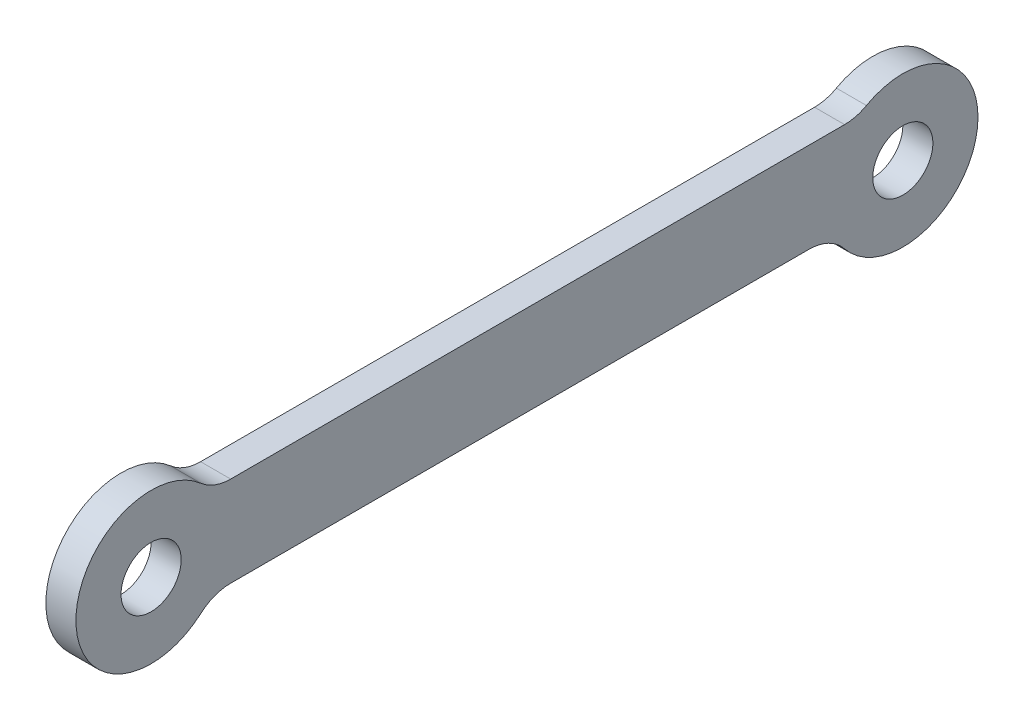
ISO-10303-21;
HEADER;
FILE_DESCRIPTION(('STEP AP214'),'2;1');
FILE_NAME('part.step','',(''),(''),'','','');
FILE_SCHEMA(('AUTOMOTIVE_DESIGN { 1 0 10303 214 1 1 1 1 }'));
ENDSEC;
DATA;
#1=APPLICATION_CONTEXT('core data for automotive mechanical design processes');
#2=APPLICATION_PROTOCOL_DEFINITION('international standard','automotive_design',2000,#1);
#3=PRODUCT_CONTEXT('',#1,'mechanical');
#4=PRODUCT('Part','Part','',(#3));
#5=PRODUCT_RELATED_PRODUCT_CATEGORY('part','',(#4));
#6=PRODUCT_DEFINITION_FORMATION('','',#4);
#7=PRODUCT_DEFINITION_CONTEXT('part definition',#1,'design');
#8=PRODUCT_DEFINITION('design','',#6,#7);
#9=PRODUCT_DEFINITION_SHAPE('','',#8);
#10=(LENGTH_UNIT() NAMED_UNIT(*) SI_UNIT(.MILLI.,.METRE.));
#11=(NAMED_UNIT(*) PLANE_ANGLE_UNIT() SI_UNIT($,.RADIAN.));
#12=(NAMED_UNIT(*) SI_UNIT($,.STERADIAN.) SOLID_ANGLE_UNIT());
#13=UNCERTAINTY_MEASURE_WITH_UNIT(LENGTH_MEASURE(1.E-05),#10,'distance_accuracy_value','');
#14=(GEOMETRIC_REPRESENTATION_CONTEXT(3) GLOBAL_UNCERTAINTY_ASSIGNED_CONTEXT((#13)) GLOBAL_UNIT_ASSIGNED_CONTEXT((#10,
#11,#12)) REPRESENTATION_CONTEXT('',''));
#15=CARTESIAN_POINT('',(0.,0.,0.));
#16=DIRECTION('',(0.,0.,1.));
#17=DIRECTION('',(1.,0.,0.));
#18=AXIS2_PLACEMENT_3D('',#15,#16,#17);
#19=CARTESIAN_POINT('',(0.,0.,0.));
#20=DIRECTION('',(1.,0.,0.));
#21=DIRECTION('',(0.,0.,-1.));
#22=AXIS2_PLACEMENT_3D('',#19,#20,#21);
#23=PLANE('',#22);
#24=CARTESIAN_POINT('',(0.,0.,0.));
#25=DIRECTION('',(1.,0.,0.));
#26=DIRECTION('',(0.,0.,-1.));
#27=AXIS2_PLACEMENT_3D('',#24,#25,#26);
#28=CIRCLE('',#27,2.);
#29=CARTESIAN_POINT('',(0.,0.,-2.));
#30=VERTEX_POINT('',#29);
#31=EDGE_CURVE('E250',#30,#30,#28,.T.);
#32=ORIENTED_EDGE('',*,*,#31,.T.);
#33=EDGE_LOOP('',(#32));
#34=FACE_BOUND('',#33,.T.);
#35=CARTESIAN_POINT('',(0.,-1.00000000000001,-50.));
#36=DIRECTION('',(1.,0.,0.));
#37=DIRECTION('',(0.,0.,-1.));
#38=AXIS2_PLACEMENT_3D('',#35,#36,#37);
#39=CIRCLE('',#38,2.);
#40=CARTESIAN_POINT('',(0.,-1.00000000000001,-52.));
#41=VERTEX_POINT('',#40);
#42=EDGE_CURVE('E252',#41,#41,#39,.T.);
#43=ORIENTED_EDGE('',*,*,#42,.T.);
#44=EDGE_LOOP('',(#43));
#45=FACE_BOUND('',#44,.T.);
#46=CARTESIAN_POINT('',(0.,0.,0.));
#47=DIRECTION('',(1.,0.,0.));
#48=DIRECTION('',(0.,0.,-1.));
#49=AXIS2_PLACEMENT_3D('',#46,#47,#48);
#50=CIRCLE('',#49,4.99999999999999);
#51=CARTESIAN_POINT('',(0.,3.74999999999999,-3.30718913883074));
#52=VERTEX_POINT('',#51);
#53=CARTESIAN_POINT('',(0.,-3.75,-3.30718913883072));
#54=VERTEX_POINT('',#53);
#55=EDGE_CURVE('E154',#52,#54,#50,.T.);
#56=ORIENTED_EDGE('',*,*,#55,.F.);
#57=CARTESIAN_POINT('',(0.,5.99999999999999,-5.29150262212918));
#58=DIRECTION('',(1.,0.,0.));
#59=DIRECTION('',(0.,0.,-1.));
#60=AXIS2_PLACEMENT_3D('',#57,#58,#59);
#61=CIRCLE('',#60,3.);
#62=CARTESIAN_POINT('',(0.,2.99999999999999,-5.29150262212918));
#63=VERTEX_POINT('',#62);
#64=EDGE_CURVE('E75',#52,#63,#61,.T.);
#65=ORIENTED_EDGE('',*,*,#64,.T.);
#66=DIRECTION('',(0.,0.,-1.));
#67=VECTOR('',#66,1.);
#68=CARTESIAN_POINT('',(0.,2.99999999999999,0.));
#69=LINE('',#68,#67);
#70=CARTESIAN_POINT('',(0.,2.99999999999999,-46.1270166537926));
#71=VERTEX_POINT('',#70);
#72=EDGE_CURVE('E261',#63,#71,#69,.T.);
#73=ORIENTED_EDGE('',*,*,#72,.T.);
#74=CARTESIAN_POINT('',(0.,5.99999999999999,-46.1270166537926));
#75=DIRECTION('',(1.,0.,0.));
#76=DIRECTION('',(0.,0.,-1.));
#77=AXIS2_PLACEMENT_3D('',#74,#75,#76);
#78=CIRCLE('',#77,3.);
#79=CARTESIAN_POINT('',(0.,3.375,-47.5793854086204));
#80=VERTEX_POINT('',#79);
#81=EDGE_CURVE('E82',#71,#80,#78,.T.);
#82=ORIENTED_EDGE('',*,*,#81,.T.);
#83=CARTESIAN_POINT('',(0.,-1.00000000000001,-50.));
#84=DIRECTION('',(1.,0.,0.));
#85=DIRECTION('',(0.,0.,-1.));
#86=AXIS2_PLACEMENT_3D('',#83,#84,#85);
#87=CIRCLE('',#86,5.);
#88=CARTESIAN_POINT('',(0.,-4.125,-46.096876251001));
#89=VERTEX_POINT('',#88);
#90=EDGE_CURVE('E251',#89,#80,#87,.T.);
#91=ORIENTED_EDGE('',*,*,#90,.F.);
#92=CARTESIAN_POINT('',(0.,-6.00000000000001,-43.7550020016016));
#93=DIRECTION('',(1.,0.,0.));
#94=DIRECTION('',(0.,0.,-1.));
#95=AXIS2_PLACEMENT_3D('',#92,#93,#94);
#96=CIRCLE('',#95,3.);
#97=CARTESIAN_POINT('',(0.,-3.00000000000001,-43.7550020016016));
#98=VERTEX_POINT('',#97);
#99=EDGE_CURVE('E143',#89,#98,#96,.T.);
#100=ORIENTED_EDGE('',*,*,#99,.T.);
#101=DIRECTION('',(0.,0.,-1.));
#102=VECTOR('',#101,1.);
#103=CARTESIAN_POINT('',(0.,-3.00000000000001,0.));
#104=LINE('',#103,#102);
#105=CARTESIAN_POINT('',(0.,-3.00000000000001,-5.29150262212916));
#106=VERTEX_POINT('',#105);
#107=EDGE_CURVE('E192',#106,#98,#104,.T.);
#108=ORIENTED_EDGE('',*,*,#107,.F.);
#109=CARTESIAN_POINT('',(0.,-6.00000000000001,-5.29150262212916));
#110=DIRECTION('',(1.,0.,0.));
#111=DIRECTION('',(0.,0.,-1.));
#112=AXIS2_PLACEMENT_3D('',#109,#110,#111);
#113=CIRCLE('',#112,3.);
#114=EDGE_CURVE('E144',#106,#54,#113,.T.);
#115=ORIENTED_EDGE('',*,*,#114,.T.);
#116=EDGE_LOOP('',(#56,#65,#73,#82,#91,#100,#108,#115));
#117=FACE_BOUND('',#116,.T.);
#118=ADVANCED_FACE('F67',(#34,#45,#117),#23,.F.);
#119=CARTESIAN_POINT('',(2.,0.,0.));
#120=DIRECTION('',(1.,0.,0.));
#121=DIRECTION('',(0.,0.,-1.));
#122=AXIS2_PLACEMENT_3D('',#119,#120,#121);
#123=PLANE('',#122);
#124=CARTESIAN_POINT('',(2.,0.,0.));
#125=DIRECTION('',(1.,0.,0.));
#126=DIRECTION('',(0.,0.,-1.));
#127=AXIS2_PLACEMENT_3D('',#124,#125,#126);
#128=CIRCLE('',#127,2.);
#129=CARTESIAN_POINT('',(2.,0.,-2.));
#130=VERTEX_POINT('',#129);
#131=EDGE_CURVE('E248',#130,#130,#128,.T.);
#132=ORIENTED_EDGE('',*,*,#131,.F.);
#133=EDGE_LOOP('',(#132));
#134=FACE_BOUND('',#133,.T.);
#135=CARTESIAN_POINT('',(2.,-1.00000000000001,-50.));
#136=DIRECTION('',(1.,0.,0.));
#137=DIRECTION('',(0.,0.,-1.));
#138=AXIS2_PLACEMENT_3D('',#135,#136,#137);
#139=CIRCLE('',#138,2.);
#140=CARTESIAN_POINT('',(2.,-1.00000000000001,-52.));
#141=VERTEX_POINT('',#140);
#142=EDGE_CURVE('E267',#141,#141,#139,.T.);
#143=ORIENTED_EDGE('',*,*,#142,.F.);
#144=EDGE_LOOP('',(#143));
#145=FACE_BOUND('',#144,.T.);
#146=DIRECTION('',(0.,0.,-1.));
#147=VECTOR('',#146,1.);
#148=CARTESIAN_POINT('',(2.,-3.00000000000001,0.));
#149=LINE('',#148,#147);
#150=CARTESIAN_POINT('',(2.,-3.00000000000001,-5.29150262212916));
#151=VERTEX_POINT('',#150);
#152=CARTESIAN_POINT('',(2.,-3.00000000000001,-43.7550020016016));
#153=VERTEX_POINT('',#152);
#154=EDGE_CURVE('E136',#151,#153,#149,.T.);
#155=ORIENTED_EDGE('',*,*,#154,.T.);
#156=CARTESIAN_POINT('',(2.,-6.00000000000001,-43.7550020016016));
#157=DIRECTION('',(1.,0.,0.));
#158=DIRECTION('',(0.,0.,-1.));
#159=AXIS2_PLACEMENT_3D('',#156,#157,#158);
#160=CIRCLE('',#159,3.);
#161=CARTESIAN_POINT('',(2.,-4.125,-46.096876251001));
#162=VERTEX_POINT('',#161);
#163=EDGE_CURVE('E178',#153,#162,#160,.F.);
#164=ORIENTED_EDGE('',*,*,#163,.T.);
#165=CARTESIAN_POINT('',(2.,-1.00000000000001,-50.));
#166=DIRECTION('',(1.,0.,0.));
#167=DIRECTION('',(0.,0.,-1.));
#168=AXIS2_PLACEMENT_3D('',#165,#166,#167);
#169=CIRCLE('',#168,5.);
#170=CARTESIAN_POINT('',(2.,3.375,-47.5793854086204));
#171=VERTEX_POINT('',#170);
#172=EDGE_CURVE('E188',#162,#171,#169,.T.);
#173=ORIENTED_EDGE('',*,*,#172,.T.);
#174=CARTESIAN_POINT('',(2.,5.99999999999999,-46.1270166537926));
#175=DIRECTION('',(1.,0.,0.));
#176=DIRECTION('',(0.,0.,-1.));
#177=AXIS2_PLACEMENT_3D('',#174,#175,#176);
#178=CIRCLE('',#177,3.);
#179=CARTESIAN_POINT('',(2.,2.99999999999999,-46.1270166537926));
#180=VERTEX_POINT('',#179);
#181=EDGE_CURVE('E181',#171,#180,#178,.F.);
#182=ORIENTED_EDGE('',*,*,#181,.T.);
#183=DIRECTION('',(0.,0.,-1.));
#184=VECTOR('',#183,1.);
#185=CARTESIAN_POINT('',(2.,2.99999999999999,0.));
#186=LINE('',#185,#184);
#187=CARTESIAN_POINT('',(2.,2.99999999999999,-5.29150262212918));
#188=VERTEX_POINT('',#187);
#189=EDGE_CURVE('E155',#188,#180,#186,.T.);
#190=ORIENTED_EDGE('',*,*,#189,.F.);
#191=CARTESIAN_POINT('',(2.,5.99999999999999,-5.29150262212918));
#192=DIRECTION('',(1.,0.,0.));
#193=DIRECTION('',(0.,0.,-1.));
#194=AXIS2_PLACEMENT_3D('',#191,#192,#193);
#195=CIRCLE('',#194,3.);
#196=CARTESIAN_POINT('',(2.,3.74999999999999,-3.30718913883074));
#197=VERTEX_POINT('',#196);
#198=EDGE_CURVE('E12',#188,#197,#195,.F.);
#199=ORIENTED_EDGE('',*,*,#198,.T.);
#200=CARTESIAN_POINT('',(2.,0.,0.));
#201=DIRECTION('',(1.,0.,0.));
#202=DIRECTION('',(0.,0.,-1.));
#203=AXIS2_PLACEMENT_3D('',#200,#201,#202);
#204=CIRCLE('',#203,4.99999999999999);
#205=CARTESIAN_POINT('',(2.,-3.75,-3.30718913883072));
#206=VERTEX_POINT('',#205);
#207=EDGE_CURVE('E139',#197,#206,#204,.T.);
#208=ORIENTED_EDGE('',*,*,#207,.T.);
#209=CARTESIAN_POINT('',(2.,-6.00000000000001,-5.29150262212916));
#210=DIRECTION('',(1.,0.,0.));
#211=DIRECTION('',(0.,0.,-1.));
#212=AXIS2_PLACEMENT_3D('',#209,#210,#211);
#213=CIRCLE('',#212,3.);
#214=EDGE_CURVE('E133',#206,#151,#213,.F.);
#215=ORIENTED_EDGE('',*,*,#214,.T.);
#216=EDGE_LOOP('',(#155,#164,#173,#182,#190,#199,#208,#215));
#217=FACE_BOUND('',#216,.T.);
#218=ADVANCED_FACE('F135',(#134,#145,#217),#123,.T.);
#219=CARTESIAN_POINT('',(2.,0.,0.));
#220=DIRECTION('',(-1.,0.,0.));
#221=DIRECTION('',(0.,0.,1.));
#222=AXIS2_PLACEMENT_3D('',#219,#220,#221);
#223=CYLINDRICAL_SURFACE('',#222,4.99999999999999);
#224=ORIENTED_EDGE('',*,*,#55,.T.);
#225=DIRECTION('',(-1.,0.,0.));
#226=VECTOR('',#225,1.);
#227=CARTESIAN_POINT('',(2.,-3.75,-3.30718913883072));
#228=LINE('',#227,#226);
#229=EDGE_CURVE('E161',#54,#206,#228,.F.);
#230=ORIENTED_EDGE('',*,*,#229,.T.);
#231=ORIENTED_EDGE('',*,*,#207,.F.);
#232=DIRECTION('',(-1.,0.,0.));
#233=VECTOR('',#232,1.);
#234=CARTESIAN_POINT('',(2.,3.74999999999999,-3.30718913883074));
#235=LINE('',#234,#233);
#236=EDGE_CURVE('E158',#197,#52,#235,.T.);
#237=ORIENTED_EDGE('',*,*,#236,.T.);
#238=EDGE_LOOP('',(#224,#230,#231,#237));
#239=FACE_BOUND('',#238,.T.);
#240=ADVANCED_FACE('F207',(#239),#223,.T.);
#241=CARTESIAN_POINT('',(2.,-1.00000000000001,-50.));
#242=DIRECTION('',(-1.,0.,0.));
#243=DIRECTION('',(0.,0.,1.));
#244=AXIS2_PLACEMENT_3D('',#241,#242,#243);
#245=CYLINDRICAL_SURFACE('',#244,5.);
#246=ORIENTED_EDGE('',*,*,#172,.F.);
#247=DIRECTION('',(-1.,0.,0.));
#248=VECTOR('',#247,1.);
#249=CARTESIAN_POINT('',(2.,-4.12500000000001,-46.096876251001));
#250=LINE('',#249,#248);
#251=EDGE_CURVE('E169',#162,#89,#250,.T.);
#252=ORIENTED_EDGE('',*,*,#251,.T.);
#253=ORIENTED_EDGE('',*,*,#90,.T.);
#254=DIRECTION('',(-1.,0.,0.));
#255=VECTOR('',#254,1.);
#256=CARTESIAN_POINT('',(2.,3.375,-47.5793854086204));
#257=LINE('',#256,#255);
#258=EDGE_CURVE('E167',#80,#171,#257,.F.);
#259=ORIENTED_EDGE('',*,*,#258,.T.);
#260=EDGE_LOOP('',(#246,#252,#253,#259));
#261=FACE_BOUND('',#260,.T.);
#262=ADVANCED_FACE('F214',(#261),#245,.T.);
#263=CARTESIAN_POINT('',(2.,2.99999999999999,0.));
#264=DIRECTION('',(0.,1.,0.));
#265=DIRECTION('',(0.,0.,1.));
#266=AXIS2_PLACEMENT_3D('',#263,#264,#265);
#267=PLANE('',#266);
#268=ORIENTED_EDGE('',*,*,#189,.T.);
#269=DIRECTION('',(-1.,0.,0.));
#270=VECTOR('',#269,1.);
#271=CARTESIAN_POINT('',(2.,2.99999999999999,-46.1270166537926));
#272=LINE('',#271,#270);
#273=EDGE_CURVE('E174',#180,#71,#272,.T.);
#274=ORIENTED_EDGE('',*,*,#273,.T.);
#275=ORIENTED_EDGE('',*,*,#72,.F.);
#276=DIRECTION('',(-1.,0.,0.));
#277=VECTOR('',#276,1.);
#278=CARTESIAN_POINT('',(2.,2.99999999999999,-5.29150262212918));
#279=LINE('',#278,#277);
#280=EDGE_CURVE('E172',#63,#188,#279,.F.);
#281=ORIENTED_EDGE('',*,*,#280,.T.);
#282=EDGE_LOOP('',(#268,#274,#275,#281));
#283=FACE_BOUND('',#282,.T.);
#284=ADVANCED_FACE('F190',(#283),#267,.T.);
#285=CARTESIAN_POINT('',(2.,-3.00000000000001,0.));
#286=DIRECTION('',(0.,1.,0.));
#287=DIRECTION('',(0.,0.,1.));
#288=AXIS2_PLACEMENT_3D('',#285,#286,#287);
#289=PLANE('',#288);
#290=ORIENTED_EDGE('',*,*,#154,.F.);
#291=DIRECTION('',(1.,0.,0.));
#292=VECTOR('',#291,1.);
#293=CARTESIAN_POINT('',(0.,-3.00000000000001,-5.29150262212916));
#294=LINE('',#293,#292);
#295=EDGE_CURVE('E150',#151,#106,#294,.F.);
#296=ORIENTED_EDGE('',*,*,#295,.T.);
#297=ORIENTED_EDGE('',*,*,#107,.T.);
#298=DIRECTION('',(1.,0.,0.));
#299=VECTOR('',#298,1.);
#300=CARTESIAN_POINT('',(2.,-3.00000000000001,-43.7550020016016));
#301=LINE('',#300,#299);
#302=EDGE_CURVE('E153',#98,#153,#301,.T.);
#303=ORIENTED_EDGE('',*,*,#302,.T.);
#304=EDGE_LOOP('',(#290,#296,#297,#303));
#305=FACE_BOUND('',#304,.T.);
#306=ADVANCED_FACE('F148',(#305),#289,.F.);
#307=CARTESIAN_POINT('',(-1.2E-05,-1.00000000000001,-50.));
#308=DIRECTION('',(1.,0.,0.));
#309=DIRECTION('',(0.,0.,-1.));
#310=AXIS2_PLACEMENT_3D('',#307,#308,#309);
#311=CYLINDRICAL_SURFACE('',#310,2.);
#312=CARTESIAN_POINT('',(2.,-1.00000000000001,-52.));
#313=CARTESIAN_POINT('',(1.97916666666667,-1.00000000000001,-52.));
#314=CARTESIAN_POINT('',(1.95833333333333,-1.00000000000001,-52.));
#315=CARTESIAN_POINT('',(1.91666666666667,-1.00000000000001,-52.));
#316=CARTESIAN_POINT('',(1.89583333333333,-1.00000000000001,-52.));
#317=CARTESIAN_POINT('',(1.85416666666667,-1.00000000000001,-52.));
#318=CARTESIAN_POINT('',(1.83333333333333,-1.00000000000001,-52.));
#319=CARTESIAN_POINT('',(1.79166666666667,-1.00000000000001,-52.));
#320=CARTESIAN_POINT('',(1.77083333333333,-1.00000000000001,-52.));
#321=CARTESIAN_POINT('',(1.72916666666667,-1.00000000000001,-52.));
#322=CARTESIAN_POINT('',(1.70833333333333,-1.00000000000001,-52.));
#323=CARTESIAN_POINT('',(1.66666666666667,-1.00000000000001,-52.));
#324=CARTESIAN_POINT('',(1.64583333333333,-1.00000000000001,-52.));
#325=CARTESIAN_POINT('',(1.60416666666667,-1.00000000000001,-52.));
#326=CARTESIAN_POINT('',(1.58333333333333,-1.00000000000001,-52.));
#327=CARTESIAN_POINT('',(1.54166666666667,-1.00000000000001,-52.));
#328=CARTESIAN_POINT('',(1.52083333333333,-1.00000000000001,-52.));
#329=CARTESIAN_POINT('',(1.47916666666667,-1.00000000000001,-52.));
#330=CARTESIAN_POINT('',(1.45833333333333,-1.00000000000001,-52.));
#331=CARTESIAN_POINT('',(1.41666666666667,-1.00000000000001,-52.));
#332=CARTESIAN_POINT('',(1.39583333333333,-1.00000000000001,-52.));
#333=CARTESIAN_POINT('',(1.35416666666667,-1.00000000000001,-52.));
#334=CARTESIAN_POINT('',(1.33333333333333,-1.00000000000001,-52.));
#335=CARTESIAN_POINT('',(1.29166666666667,-1.00000000000001,-52.));
#336=CARTESIAN_POINT('',(1.27083333333333,-1.00000000000001,-52.));
#337=CARTESIAN_POINT('',(1.22916666666667,-1.00000000000001,-52.));
#338=CARTESIAN_POINT('',(1.20833333333333,-1.00000000000001,-52.));
#339=CARTESIAN_POINT('',(1.16666666666667,-1.00000000000001,-52.));
#340=CARTESIAN_POINT('',(1.14583333333333,-1.00000000000001,-52.));
#341=CARTESIAN_POINT('',(1.10416666666667,-1.00000000000001,-52.));
#342=CARTESIAN_POINT('',(1.08333333333333,-1.00000000000001,-52.));
#343=CARTESIAN_POINT('',(1.04166666666667,-1.00000000000001,-52.));
#344=CARTESIAN_POINT('',(1.02083333333333,-1.00000000000001,-52.));
#345=CARTESIAN_POINT('',(0.979166666666667,-1.00000000000001,-52.));
#346=CARTESIAN_POINT('',(0.958333333333334,-1.00000000000001,-52.));
#347=CARTESIAN_POINT('',(0.916666666666667,-1.00000000000001,-52.));
#348=CARTESIAN_POINT('',(0.895833333333334,-1.00000000000001,-52.));
#349=CARTESIAN_POINT('',(0.854166666666667,-1.00000000000001,-52.));
#350=CARTESIAN_POINT('',(0.833333333333334,-1.00000000000001,-52.));
#351=CARTESIAN_POINT('',(0.791666666666667,-1.00000000000001,-52.));
#352=CARTESIAN_POINT('',(0.770833333333334,-1.00000000000001,-52.));
#353=CARTESIAN_POINT('',(0.729166666666667,-1.00000000000001,-52.));
#354=CARTESIAN_POINT('',(0.708333333333334,-1.00000000000001,-52.));
#355=CARTESIAN_POINT('',(0.666666666666667,-1.00000000000001,-52.));
#356=CARTESIAN_POINT('',(0.645833333333334,-1.00000000000001,-52.));
#357=CARTESIAN_POINT('',(0.604166666666667,-1.00000000000001,-52.));
#358=CARTESIAN_POINT('',(0.583333333333333,-1.00000000000001,-52.));
#359=CARTESIAN_POINT('',(0.541666666666667,-1.00000000000001,-52.));
#360=CARTESIAN_POINT('',(0.520833333333333,-1.00000000000001,-52.));
#361=CARTESIAN_POINT('',(0.479166666666667,-1.00000000000001,-52.));
#362=CARTESIAN_POINT('',(0.458333333333334,-1.00000000000001,-52.));
#363=CARTESIAN_POINT('',(0.416666666666667,-1.00000000000001,-52.));
#364=CARTESIAN_POINT('',(0.395833333333334,-1.00000000000001,-52.));
#365=CARTESIAN_POINT('',(0.354166666666667,-1.00000000000001,-52.));
#366=CARTESIAN_POINT('',(0.333333333333334,-1.00000000000001,-52.));
#367=CARTESIAN_POINT('',(0.291666666666667,-1.00000000000001,-52.));
#368=CARTESIAN_POINT('',(0.270833333333333,-1.00000000000001,-52.));
#369=CARTESIAN_POINT('',(0.229166666666667,-1.00000000000001,-52.));
#370=CARTESIAN_POINT('',(0.208333333333333,-1.00000000000001,-52.));
#371=CARTESIAN_POINT('',(0.166666666666667,-1.00000000000001,-52.));
#372=CARTESIAN_POINT('',(0.145833333333334,-1.00000000000001,-52.));
#373=CARTESIAN_POINT('',(0.104166666666667,-1.00000000000001,-52.));
#374=CARTESIAN_POINT('',(0.0833333333333336,-1.00000000000001,-52.));
#375=CARTESIAN_POINT('',(0.0416666666666669,-1.00000000000001,-52.));
#376=CARTESIAN_POINT('',(0.0208333333333335,-1.00000000000001,-52.));
#377=CARTESIAN_POINT('',(0.,-1.00000000000001,-52.));
#378=B_SPLINE_CURVE_WITH_KNOTS('',3,(#312,#313,#314,#315,#316,#317,#318,#319,#320,#321,#322,
#323,#324,#325,#326,#327,#328,#329,#330,#331,#332,#333,#334,#335,#336,#337,#338,#339,#340,#341,
#342,#343,#344,#345,#346,#347,#348,#349,#350,#351,#352,#353,#354,#355,#356,#357,#358,#359,#360,
#361,#362,#363,#364,#365,#366,#367,#368,#369,#370,#371,#372,#373,#374,#375,#376,#377),
.UNSPECIFIED.,.F.,.F.,(4,2,2,2,2,2,2,2,2,2,2,2,2,2,2,2,2,2,2,2,2,2,2,2,2,2,2,2,2,2,2,2,4),(0.,
0.0624999999999996,0.125,0.1875,0.25,0.3125,0.375,0.4375,0.5,0.5625,0.625,0.6875,0.75,0.8125,
0.875,0.9375,1.,1.0625,1.125,1.1875,1.25,1.3125,1.375,1.4375,1.5,1.5625,1.625,1.6875,1.75,
1.8125,1.875,1.9375,2.),.UNSPECIFIED.);
#379=EDGE_CURVE('BSEAM213',#141,#41,#378,.T.);
#380=ORIENTED_EDGE('',*,*,#142,.T.);
#381=ORIENTED_EDGE('',*,*,#42,.F.);
#382=ORIENTED_EDGE('',*,*,#379,.T.);
#383=ORIENTED_EDGE('',*,*,#379,.F.);
#384=EDGE_LOOP('',(#380,#382,#381,#383));
#385=FACE_BOUND('',#384,.T.);
#386=ADVANCED_FACE('F213',(#385),#311,.F.);
#387=CARTESIAN_POINT('',(-1.2E-05,0.,0.));
#388=DIRECTION('',(1.,0.,0.));
#389=DIRECTION('',(0.,0.,-1.));
#390=AXIS2_PLACEMENT_3D('',#387,#388,#389);
#391=CYLINDRICAL_SURFACE('',#390,2.);
#392=CARTESIAN_POINT('',(2.,0.,-2.));
#393=CARTESIAN_POINT('',(1.97916666666667,0.,-2.));
#394=CARTESIAN_POINT('',(1.95833333333333,0.,-2.));
#395=CARTESIAN_POINT('',(1.91666666666667,0.,-2.));
#396=CARTESIAN_POINT('',(1.89583333333333,0.,-2.));
#397=CARTESIAN_POINT('',(1.85416666666667,0.,-2.));
#398=CARTESIAN_POINT('',(1.83333333333333,0.,-2.));
#399=CARTESIAN_POINT('',(1.79166666666667,0.,-2.));
#400=CARTESIAN_POINT('',(1.77083333333333,0.,-2.));
#401=CARTESIAN_POINT('',(1.72916666666667,0.,-2.));
#402=CARTESIAN_POINT('',(1.70833333333333,0.,-2.));
#403=CARTESIAN_POINT('',(1.66666666666667,0.,-2.));
#404=CARTESIAN_POINT('',(1.64583333333333,0.,-2.));
#405=CARTESIAN_POINT('',(1.60416666666667,0.,-2.));
#406=CARTESIAN_POINT('',(1.58333333333333,0.,-2.));
#407=CARTESIAN_POINT('',(1.54166666666667,0.,-2.));
#408=CARTESIAN_POINT('',(1.52083333333333,0.,-2.));
#409=CARTESIAN_POINT('',(1.47916666666667,0.,-2.));
#410=CARTESIAN_POINT('',(1.45833333333333,0.,-2.));
#411=CARTESIAN_POINT('',(1.41666666666667,0.,-2.));
#412=CARTESIAN_POINT('',(1.39583333333333,0.,-2.));
#413=CARTESIAN_POINT('',(1.35416666666667,0.,-2.));
#414=CARTESIAN_POINT('',(1.33333333333333,0.,-2.));
#415=CARTESIAN_POINT('',(1.29166666666667,0.,-2.));
#416=CARTESIAN_POINT('',(1.27083333333333,0.,-2.));
#417=CARTESIAN_POINT('',(1.22916666666667,0.,-2.));
#418=CARTESIAN_POINT('',(1.20833333333333,0.,-2.));
#419=CARTESIAN_POINT('',(1.16666666666667,0.,-2.));
#420=CARTESIAN_POINT('',(1.14583333333333,0.,-2.));
#421=CARTESIAN_POINT('',(1.10416666666667,0.,-2.));
#422=CARTESIAN_POINT('',(1.08333333333333,0.,-2.));
#423=CARTESIAN_POINT('',(1.04166666666667,0.,-2.));
#424=CARTESIAN_POINT('',(1.02083333333333,0.,-2.));
#425=CARTESIAN_POINT('',(0.979166666666667,0.,-2.));
#426=CARTESIAN_POINT('',(0.958333333333334,0.,-2.));
#427=CARTESIAN_POINT('',(0.916666666666667,0.,-2.));
#428=CARTESIAN_POINT('',(0.895833333333334,0.,-2.));
#429=CARTESIAN_POINT('',(0.854166666666667,0.,-2.));
#430=CARTESIAN_POINT('',(0.833333333333334,0.,-2.));
#431=CARTESIAN_POINT('',(0.791666666666667,0.,-2.));
#432=CARTESIAN_POINT('',(0.770833333333334,0.,-2.));
#433=CARTESIAN_POINT('',(0.729166666666667,0.,-2.));
#434=CARTESIAN_POINT('',(0.708333333333334,0.,-2.));
#435=CARTESIAN_POINT('',(0.666666666666667,0.,-2.));
#436=CARTESIAN_POINT('',(0.645833333333334,0.,-2.));
#437=CARTESIAN_POINT('',(0.604166666666667,0.,-2.));
#438=CARTESIAN_POINT('',(0.583333333333333,0.,-2.));
#439=CARTESIAN_POINT('',(0.541666666666667,0.,-2.));
#440=CARTESIAN_POINT('',(0.520833333333333,0.,-2.));
#441=CARTESIAN_POINT('',(0.479166666666667,0.,-2.));
#442=CARTESIAN_POINT('',(0.458333333333334,0.,-2.));
#443=CARTESIAN_POINT('',(0.416666666666667,0.,-2.));
#444=CARTESIAN_POINT('',(0.395833333333334,0.,-2.));
#445=CARTESIAN_POINT('',(0.354166666666667,0.,-2.));
#446=CARTESIAN_POINT('',(0.333333333333334,0.,-2.));
#447=CARTESIAN_POINT('',(0.291666666666667,0.,-2.));
#448=CARTESIAN_POINT('',(0.270833333333333,0.,-2.));
#449=CARTESIAN_POINT('',(0.229166666666667,0.,-2.));
#450=CARTESIAN_POINT('',(0.208333333333333,0.,-2.));
#451=CARTESIAN_POINT('',(0.166666666666667,0.,-2.));
#452=CARTESIAN_POINT('',(0.145833333333334,0.,-2.));
#453=CARTESIAN_POINT('',(0.104166666666667,0.,-2.));
#454=CARTESIAN_POINT('',(0.0833333333333336,0.,-2.));
#455=CARTESIAN_POINT('',(0.0416666666666669,0.,-2.));
#456=CARTESIAN_POINT('',(0.0208333333333335,0.,-2.));
#457=CARTESIAN_POINT('',(0.,0.,-2.));
#458=B_SPLINE_CURVE_WITH_KNOTS('',3,(#392,#393,#394,#395,#396,#397,#398,#399,#400,#401,#402,
#403,#404,#405,#406,#407,#408,#409,#410,#411,#412,#413,#414,#415,#416,#417,#418,#419,#420,#421,
#422,#423,#424,#425,#426,#427,#428,#429,#430,#431,#432,#433,#434,#435,#436,#437,#438,#439,#440,
#441,#442,#443,#444,#445,#446,#447,#448,#449,#450,#451,#452,#453,#454,#455,#456,#457),
.UNSPECIFIED.,.F.,.F.,(4,2,2,2,2,2,2,2,2,2,2,2,2,2,2,2,2,2,2,2,2,2,2,2,2,2,2,2,2,2,2,2,4),(0.,
0.0624999999999996,0.125,0.1875,0.25,0.3125,0.375,0.4375,0.5,0.5625,0.625,0.6875,0.75,0.8125,
0.875,0.9375,1.,1.0625,1.125,1.1875,1.25,1.3125,1.375,1.4375,1.5,1.5625,1.625,1.6875,1.75,
1.8125,1.875,1.9375,2.),.UNSPECIFIED.);
#459=EDGE_CURVE('BSEAM232',#130,#30,#458,.T.);
#460=ORIENTED_EDGE('',*,*,#131,.T.);
#461=ORIENTED_EDGE('',*,*,#31,.F.);
#462=ORIENTED_EDGE('',*,*,#459,.T.);
#463=ORIENTED_EDGE('',*,*,#459,.F.);
#464=EDGE_LOOP('',(#460,#462,#461,#463));
#465=FACE_BOUND('',#464,.T.);
#466=ADVANCED_FACE('F232',(#465),#391,.F.);
#467=CARTESIAN_POINT('',(2.,-6.00000000000001,-5.29150262212916));
#468=DIRECTION('',(-1.,0.,0.));
#469=DIRECTION('',(0.,0.,1.));
#470=AXIS2_PLACEMENT_3D('',#467,#468,#469);
#471=CYLINDRICAL_SURFACE('',#470,3.);
#472=ORIENTED_EDGE('',*,*,#214,.F.);
#473=ORIENTED_EDGE('',*,*,#229,.F.);
#474=ORIENTED_EDGE('',*,*,#114,.F.);
#475=ORIENTED_EDGE('',*,*,#295,.F.);
#476=EDGE_LOOP('',(#472,#473,#474,#475));
#477=FACE_BOUND('',#476,.T.);
#478=ADVANCED_FACE('F157',(#477),#471,.F.);
#479=CARTESIAN_POINT('',(2.,-6.00000000000001,-43.7550020016016));
#480=DIRECTION('',(-1.,0.,0.));
#481=DIRECTION('',(0.,0.,1.));
#482=AXIS2_PLACEMENT_3D('',#479,#480,#481);
#483=CYLINDRICAL_SURFACE('',#482,3.);
#484=ORIENTED_EDGE('',*,*,#163,.F.);
#485=ORIENTED_EDGE('',*,*,#302,.F.);
#486=ORIENTED_EDGE('',*,*,#99,.F.);
#487=ORIENTED_EDGE('',*,*,#251,.F.);
#488=EDGE_LOOP('',(#484,#485,#486,#487));
#489=FACE_BOUND('',#488,.T.);
#490=ADVANCED_FACE('F196',(#489),#483,.F.);
#491=CARTESIAN_POINT('',(2.,5.99999999999999,-46.1270166537926));
#492=DIRECTION('',(-1.,0.,0.));
#493=DIRECTION('',(0.,0.,1.));
#494=AXIS2_PLACEMENT_3D('',#491,#492,#493);
#495=CYLINDRICAL_SURFACE('',#494,3.);
#496=ORIENTED_EDGE('',*,*,#181,.F.);
#497=ORIENTED_EDGE('',*,*,#258,.F.);
#498=ORIENTED_EDGE('',*,*,#81,.F.);
#499=ORIENTED_EDGE('',*,*,#273,.F.);
#500=EDGE_LOOP('',(#496,#497,#498,#499));
#501=FACE_BOUND('',#500,.T.);
#502=ADVANCED_FACE('F194',(#501),#495,.F.);
#503=CARTESIAN_POINT('',(2.,5.99999999999999,-5.29150262212918));
#504=DIRECTION('',(-1.,0.,0.));
#505=DIRECTION('',(0.,0.,1.));
#506=AXIS2_PLACEMENT_3D('',#503,#504,#505);
#507=CYLINDRICAL_SURFACE('',#506,3.);
#508=ORIENTED_EDGE('',*,*,#198,.F.);
#509=ORIENTED_EDGE('',*,*,#280,.F.);
#510=ORIENTED_EDGE('',*,*,#64,.F.);
#511=ORIENTED_EDGE('',*,*,#236,.F.);
#512=EDGE_LOOP('',(#508,#509,#510,#511));
#513=FACE_BOUND('',#512,.T.);
#514=ADVANCED_FACE('F69',(#513),#507,.F.);
#515=CLOSED_SHELL('',(#118,#218,#240,#262,#284,#306,#386,#466,#478,#490,#502,#514));
#516=MANIFOLD_SOLID_BREP('B2',#515);
#517=ADVANCED_BREP_SHAPE_REPRESENTATION('',(#18,#516),#14);
#518=SHAPE_DEFINITION_REPRESENTATION(#9,#517);
ENDSEC;
END-ISO-10303-21;
